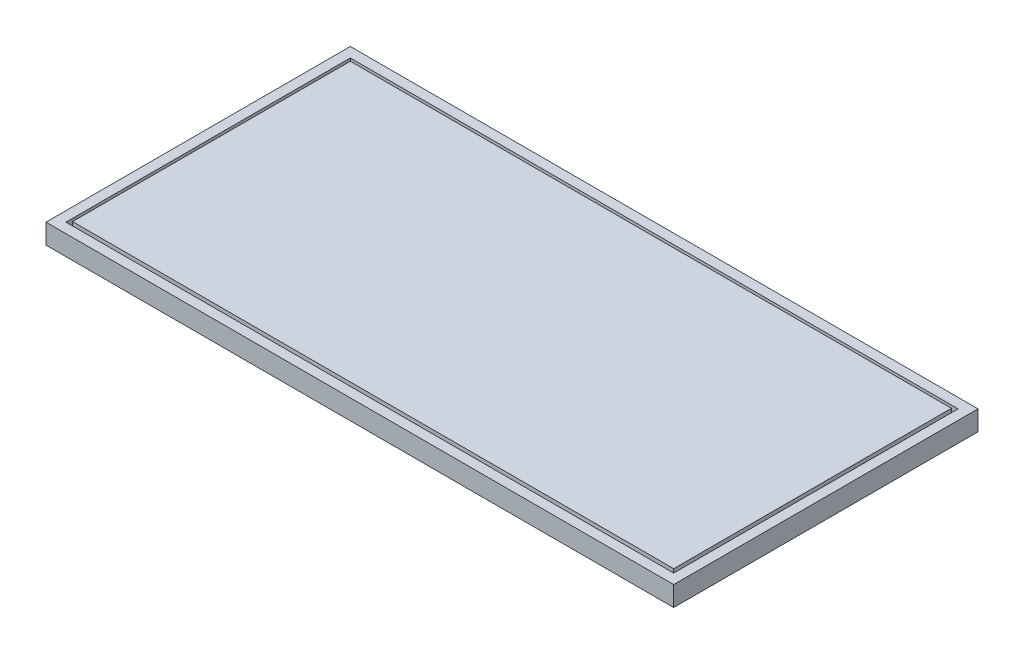
ISO-10303-21;
HEADER;
FILE_DESCRIPTION(('STEP AP214'),'2;1');
FILE_NAME('part.step','',(''),(''),'','','');
FILE_SCHEMA(('AUTOMOTIVE_DESIGN { 1 0 10303 214 1 1 1 1 }'));
ENDSEC;
DATA;
#1=APPLICATION_CONTEXT('core data for automotive mechanical design processes');
#2=APPLICATION_PROTOCOL_DEFINITION('international standard','automotive_design',2000,#1);
#3=PRODUCT_CONTEXT('',#1,'mechanical');
#4=PRODUCT('Part','Part','',(#3));
#5=PRODUCT_RELATED_PRODUCT_CATEGORY('part','',(#4));
#6=PRODUCT_DEFINITION_FORMATION('','',#4);
#7=PRODUCT_DEFINITION_CONTEXT('part definition',#1,'design');
#8=PRODUCT_DEFINITION('design','',#6,#7);
#9=PRODUCT_DEFINITION_SHAPE('','',#8);
#10=(LENGTH_UNIT() NAMED_UNIT(*) SI_UNIT(.MILLI.,.METRE.));
#11=(NAMED_UNIT(*) PLANE_ANGLE_UNIT() SI_UNIT($,.RADIAN.));
#12=(NAMED_UNIT(*) SI_UNIT($,.STERADIAN.) SOLID_ANGLE_UNIT());
#13=UNCERTAINTY_MEASURE_WITH_UNIT(LENGTH_MEASURE(1.E-05),#10,'distance_accuracy_value','');
#14=(GEOMETRIC_REPRESENTATION_CONTEXT(3) GLOBAL_UNCERTAINTY_ASSIGNED_CONTEXT((#13)) GLOBAL_UNIT_ASSIGNED_CONTEXT((#10,
#11,#12)) REPRESENTATION_CONTEXT('',''));
#15=CARTESIAN_POINT('',(0.,0.,0.));
#16=DIRECTION('',(0.,0.,1.));
#17=DIRECTION('',(1.,0.,0.));
#18=AXIS2_PLACEMENT_3D('',#15,#16,#17);
#19=CARTESIAN_POINT('',(0.,1.524,-23.3045));
#20=DIRECTION('',(0.,0.,-1.));
#21=DIRECTION('',(-1.,0.,0.));
#22=AXIS2_PLACEMENT_3D('',#19,#20,#21);
#23=PLANE('',#22);
#24=DIRECTION('',(0.,-1.,0.));
#25=VECTOR('',#24,1.);
#26=CARTESIAN_POINT('',(48.0695,1.524,-23.3045));
#27=LINE('',#26,#25);
#28=CARTESIAN_POINT('',(48.0695,1.524,-23.3045));
#29=VERTEX_POINT('',#28);
#30=CARTESIAN_POINT('',(48.0695,-1.524,-23.3045));
#31=VERTEX_POINT('',#30);
#32=EDGE_CURVE('E168',#29,#31,#27,.T.);
#33=ORIENTED_EDGE('',*,*,#32,.T.);
#34=DIRECTION('',(1.,0.,0.));
#35=VECTOR('',#34,1.);
#36=CARTESIAN_POINT('',(0.,-1.524,-23.3045));
#37=LINE('',#36,#35);
#38=CARTESIAN_POINT('',(-48.0695,-1.524,-23.3045));
#39=VERTEX_POINT('',#38);
#40=EDGE_CURVE('E138',#39,#31,#37,.T.);
#41=ORIENTED_EDGE('',*,*,#40,.F.);
#42=DIRECTION('',(0.,-1.,0.));
#43=VECTOR('',#42,1.);
#44=CARTESIAN_POINT('',(-48.0695,1.524,-23.3045));
#45=LINE('',#44,#43);
#46=CARTESIAN_POINT('',(-48.0695,1.524,-23.3045));
#47=VERTEX_POINT('',#46);
#48=EDGE_CURVE('E12',#47,#39,#45,.T.);
#49=ORIENTED_EDGE('',*,*,#48,.F.);
#50=DIRECTION('',(1.,0.,0.));
#51=VECTOR('',#50,1.);
#52=CARTESIAN_POINT('',(0.,1.524,-23.3045));
#53=LINE('',#52,#51);
#54=EDGE_CURVE('E157',#47,#29,#53,.T.);
#55=ORIENTED_EDGE('',*,*,#54,.T.);
#56=EDGE_LOOP('',(#33,#41,#49,#55));
#57=FACE_BOUND('',#56,.T.);
#58=ADVANCED_FACE('F43',(#57),#23,.T.);
#59=CARTESIAN_POINT('',(-48.0695,1.524,0.));
#60=DIRECTION('',(-1.,0.,0.));
#61=DIRECTION('',(0.,0.,1.));
#62=AXIS2_PLACEMENT_3D('',#59,#60,#61);
#63=PLANE('',#62);
#64=ORIENTED_EDGE('',*,*,#48,.T.);
#65=DIRECTION('',(0.,0.,-1.));
#66=VECTOR('',#65,1.);
#67=CARTESIAN_POINT('',(-48.0695,-1.524,0.));
#68=LINE('',#67,#66);
#69=CARTESIAN_POINT('',(-48.0695,-1.524,23.3045));
#70=VERTEX_POINT('',#69);
#71=EDGE_CURVE('E147',#70,#39,#68,.T.);
#72=ORIENTED_EDGE('',*,*,#71,.F.);
#73=DIRECTION('',(0.,-1.,0.));
#74=VECTOR('',#73,1.);
#75=CARTESIAN_POINT('',(-48.0695,1.524,23.3045));
#76=LINE('',#75,#74);
#77=CARTESIAN_POINT('',(-48.0695,1.524,23.3045));
#78=VERTEX_POINT('',#77);
#79=EDGE_CURVE('E52',#78,#70,#76,.T.);
#80=ORIENTED_EDGE('',*,*,#79,.F.);
#81=DIRECTION('',(0.,0.,-1.));
#82=VECTOR('',#81,1.);
#83=CARTESIAN_POINT('',(-48.0695,1.524,0.));
#84=LINE('',#83,#82);
#85=EDGE_CURVE('E120',#78,#47,#84,.T.);
#86=ORIENTED_EDGE('',*,*,#85,.T.);
#87=EDGE_LOOP('',(#64,#72,#80,#86));
#88=FACE_BOUND('',#87,.T.);
#89=ADVANCED_FACE('F188',(#88),#63,.T.);
#90=CARTESIAN_POINT('',(0.,1.524,23.3045));
#91=DIRECTION('',(0.,0.,1.));
#92=DIRECTION('',(1.,0.,0.));
#93=AXIS2_PLACEMENT_3D('',#90,#91,#92);
#94=PLANE('',#93);
#95=ORIENTED_EDGE('',*,*,#79,.T.);
#96=DIRECTION('',(-1.,0.,0.));
#97=VECTOR('',#96,1.);
#98=CARTESIAN_POINT('',(0.,-1.524,23.3045));
#99=LINE('',#98,#97);
#100=CARTESIAN_POINT('',(48.0695,-1.524,23.3045));
#101=VERTEX_POINT('',#100);
#102=EDGE_CURVE('E144',#101,#70,#99,.T.);
#103=ORIENTED_EDGE('',*,*,#102,.F.);
#104=DIRECTION('',(0.,-1.,0.));
#105=VECTOR('',#104,1.);
#106=CARTESIAN_POINT('',(48.0695,1.524,23.3045));
#107=LINE('',#106,#105);
#108=CARTESIAN_POINT('',(48.0695,1.524,23.3045));
#109=VERTEX_POINT('',#108);
#110=EDGE_CURVE('E166',#109,#101,#107,.T.);
#111=ORIENTED_EDGE('',*,*,#110,.F.);
#112=DIRECTION('',(-1.,0.,0.));
#113=VECTOR('',#112,1.);
#114=CARTESIAN_POINT('',(0.,1.524,23.3045));
#115=LINE('',#114,#113);
#116=EDGE_CURVE('E162',#109,#78,#115,.T.);
#117=ORIENTED_EDGE('',*,*,#116,.T.);
#118=EDGE_LOOP('',(#95,#103,#111,#117));
#119=FACE_BOUND('',#118,.T.);
#120=ADVANCED_FACE('F193',(#119),#94,.T.);
#121=CARTESIAN_POINT('',(46.5455,1.524,0.));
#122=DIRECTION('',(1.,0.,0.));
#123=DIRECTION('',(0.,0.,-1.));
#124=AXIS2_PLACEMENT_3D('',#121,#122,#123);
#125=PLANE('',#124);
#126=DIRECTION('',(0.,-1.,0.));
#127=VECTOR('',#126,1.);
#128=CARTESIAN_POINT('',(46.5455,1.524,-21.7805));
#129=LINE('',#128,#127);
#130=CARTESIAN_POINT('',(46.5455,1.524,-21.7805));
#131=VERTEX_POINT('',#130);
#132=CARTESIAN_POINT('',(46.5455,-1.524,-21.7805));
#133=VERTEX_POINT('',#132);
#134=EDGE_CURVE('E47',#131,#133,#129,.T.);
#135=ORIENTED_EDGE('',*,*,#134,.T.);
#136=DIRECTION('',(0.,0.,1.));
#137=VECTOR('',#136,1.);
#138=CARTESIAN_POINT('',(46.5455,-1.524,0.));
#139=LINE('',#138,#137);
#140=CARTESIAN_POINT('',(46.5455,-1.524,21.7805));
#141=VERTEX_POINT('',#140);
#142=EDGE_CURVE('E112',#133,#141,#139,.T.);
#143=ORIENTED_EDGE('',*,*,#142,.T.);
#144=DIRECTION('',(0.,-1.,0.));
#145=VECTOR('',#144,1.);
#146=CARTESIAN_POINT('',(46.5455,1.524,21.7805));
#147=LINE('',#146,#145);
#148=CARTESIAN_POINT('',(46.5455,1.524,21.7805));
#149=VERTEX_POINT('',#148);
#150=EDGE_CURVE('E170',#149,#141,#147,.T.);
#151=ORIENTED_EDGE('',*,*,#150,.F.);
#152=DIRECTION('',(0.,0.,1.));
#153=VECTOR('',#152,1.);
#154=CARTESIAN_POINT('',(46.5455,1.524,0.));
#155=LINE('',#154,#153);
#156=EDGE_CURVE('E115',#131,#149,#155,.T.);
#157=ORIENTED_EDGE('',*,*,#156,.F.);
#158=EDGE_LOOP('',(#135,#143,#151,#157));
#159=FACE_BOUND('',#158,.T.);
#160=ADVANCED_FACE('F45',(#159),#125,.F.);
#161=CARTESIAN_POINT('',(0.,1.524,21.7805));
#162=DIRECTION('',(0.,0.,1.));
#163=DIRECTION('',(1.,0.,0.));
#164=AXIS2_PLACEMENT_3D('',#161,#162,#163);
#165=PLANE('',#164);
#166=ORIENTED_EDGE('',*,*,#150,.T.);
#167=DIRECTION('',(-1.,0.,0.));
#168=VECTOR('',#167,1.);
#169=CARTESIAN_POINT('',(0.,-1.524,21.7805));
#170=LINE('',#169,#168);
#171=CARTESIAN_POINT('',(-46.5455,-1.524,21.7805));
#172=VERTEX_POINT('',#171);
#173=EDGE_CURVE('E129',#141,#172,#170,.T.);
#174=ORIENTED_EDGE('',*,*,#173,.T.);
#175=DIRECTION('',(0.,-1.,0.));
#176=VECTOR('',#175,1.);
#177=CARTESIAN_POINT('',(-46.5455,1.524,21.7805));
#178=LINE('',#177,#176);
#179=CARTESIAN_POINT('',(-46.5455,1.524,21.7805));
#180=VERTEX_POINT('',#179);
#181=EDGE_CURVE('E172',#180,#172,#178,.T.);
#182=ORIENTED_EDGE('',*,*,#181,.F.);
#183=DIRECTION('',(-1.,0.,0.));
#184=VECTOR('',#183,1.);
#185=CARTESIAN_POINT('',(0.,1.524,21.7805));
#186=LINE('',#185,#184);
#187=EDGE_CURVE('E155',#149,#180,#186,.T.);
#188=ORIENTED_EDGE('',*,*,#187,.F.);
#189=EDGE_LOOP('',(#166,#174,#182,#188));
#190=FACE_BOUND('',#189,.T.);
#191=ADVANCED_FACE('F178',(#190),#165,.F.);
#192=CARTESIAN_POINT('',(-46.5455,1.524,0.));
#193=DIRECTION('',(-1.,0.,0.));
#194=DIRECTION('',(0.,0.,1.));
#195=AXIS2_PLACEMENT_3D('',#192,#193,#194);
#196=PLANE('',#195);
#197=ORIENTED_EDGE('',*,*,#181,.T.);
#198=DIRECTION('',(0.,0.,-1.));
#199=VECTOR('',#198,1.);
#200=CARTESIAN_POINT('',(-46.5455,-1.524,0.));
#201=LINE('',#200,#199);
#202=CARTESIAN_POINT('',(-46.5455,-1.524,-21.7805));
#203=VERTEX_POINT('',#202);
#204=EDGE_CURVE('E133',#172,#203,#201,.T.);
#205=ORIENTED_EDGE('',*,*,#204,.T.);
#206=DIRECTION('',(0.,-1.,0.));
#207=VECTOR('',#206,1.);
#208=CARTESIAN_POINT('',(-46.5455,1.524,-21.7805));
#209=LINE('',#208,#207);
#210=CARTESIAN_POINT('',(-46.5455,1.524,-21.7805));
#211=VERTEX_POINT('',#210);
#212=EDGE_CURVE('E119',#211,#203,#209,.T.);
#213=ORIENTED_EDGE('',*,*,#212,.F.);
#214=DIRECTION('',(0.,0.,-1.));
#215=VECTOR('',#214,1.);
#216=CARTESIAN_POINT('',(-46.5455,1.524,0.));
#217=LINE('',#216,#215);
#218=EDGE_CURVE('E153',#180,#211,#217,.T.);
#219=ORIENTED_EDGE('',*,*,#218,.F.);
#220=EDGE_LOOP('',(#197,#205,#213,#219));
#221=FACE_BOUND('',#220,.T.);
#222=ADVANCED_FACE('F176',(#221),#196,.F.);
#223=CARTESIAN_POINT('',(0.,1.524,-21.7805));
#224=DIRECTION('',(0.,0.,-1.));
#225=DIRECTION('',(-1.,0.,0.));
#226=AXIS2_PLACEMENT_3D('',#223,#224,#225);
#227=PLANE('',#226);
#228=ORIENTED_EDGE('',*,*,#212,.T.);
#229=DIRECTION('',(1.,0.,0.));
#230=VECTOR('',#229,1.);
#231=CARTESIAN_POINT('',(0.,-1.524,-21.7805));
#232=LINE('',#231,#230);
#233=EDGE_CURVE('E126',#203,#133,#232,.T.);
#234=ORIENTED_EDGE('',*,*,#233,.T.);
#235=ORIENTED_EDGE('',*,*,#134,.F.);
#236=DIRECTION('',(1.,0.,0.));
#237=VECTOR('',#236,1.);
#238=CARTESIAN_POINT('',(0.,1.524,-21.7805));
#239=LINE('',#238,#237);
#240=EDGE_CURVE('E151',#211,#131,#239,.T.);
#241=ORIENTED_EDGE('',*,*,#240,.F.);
#242=EDGE_LOOP('',(#228,#234,#235,#241));
#243=FACE_BOUND('',#242,.T.);
#244=ADVANCED_FACE('F131',(#243),#227,.F.);
#245=CARTESIAN_POINT('',(48.0695,1.524,0.));
#246=DIRECTION('',(1.,0.,0.));
#247=DIRECTION('',(0.,0.,-1.));
#248=AXIS2_PLACEMENT_3D('',#245,#246,#247);
#249=PLANE('',#248);
#250=ORIENTED_EDGE('',*,*,#110,.T.);
#251=DIRECTION('',(0.,0.,1.));
#252=VECTOR('',#251,1.);
#253=CARTESIAN_POINT('',(48.0695,-1.524,0.));
#254=LINE('',#253,#252);
#255=EDGE_CURVE('E141',#31,#101,#254,.T.);
#256=ORIENTED_EDGE('',*,*,#255,.F.);
#257=ORIENTED_EDGE('',*,*,#32,.F.);
#258=DIRECTION('',(0.,0.,1.));
#259=VECTOR('',#258,1.);
#260=CARTESIAN_POINT('',(48.0695,1.524,0.));
#261=LINE('',#260,#259);
#262=EDGE_CURVE('E159',#29,#109,#261,.T.);
#263=ORIENTED_EDGE('',*,*,#262,.T.);
#264=EDGE_LOOP('',(#250,#256,#257,#263));
#265=FACE_BOUND('',#264,.T.);
#266=ADVANCED_FACE('F183',(#265),#249,.T.);
#267=CARTESIAN_POINT('',(0.,1.524,0.));
#268=DIRECTION('',(0.,-1.,0.));
#269=DIRECTION('',(0.,0.,-1.));
#270=AXIS2_PLACEMENT_3D('',#267,#268,#269);
#271=PLANE('',#270);
#272=ORIENTED_EDGE('',*,*,#156,.T.);
#273=ORIENTED_EDGE('',*,*,#187,.T.);
#274=ORIENTED_EDGE('',*,*,#218,.T.);
#275=ORIENTED_EDGE('',*,*,#240,.T.);
#276=EDGE_LOOP('',(#272,#273,#274,#275));
#277=FACE_BOUND('',#276,.T.);
#278=ORIENTED_EDGE('',*,*,#54,.F.);
#279=ORIENTED_EDGE('',*,*,#85,.F.);
#280=ORIENTED_EDGE('',*,*,#116,.F.);
#281=ORIENTED_EDGE('',*,*,#262,.F.);
#282=EDGE_LOOP('',(#278,#279,#280,#281));
#283=FACE_BOUND('',#282,.T.);
#284=ADVANCED_FACE('F180',(#277,#283),#271,.F.);
#285=CARTESIAN_POINT('',(0.,-1.524,0.));
#286=DIRECTION('',(0.,-1.,0.));
#287=DIRECTION('',(0.,0.,-1.));
#288=AXIS2_PLACEMENT_3D('',#285,#286,#287);
#289=PLANE('',#288);
#290=ORIENTED_EDGE('',*,*,#142,.F.);
#291=ORIENTED_EDGE('',*,*,#233,.F.);
#292=ORIENTED_EDGE('',*,*,#204,.F.);
#293=ORIENTED_EDGE('',*,*,#173,.F.);
#294=EDGE_LOOP('',(#290,#291,#292,#293));
#295=FACE_BOUND('',#294,.T.);
#296=ORIENTED_EDGE('',*,*,#40,.T.);
#297=ORIENTED_EDGE('',*,*,#255,.T.);
#298=ORIENTED_EDGE('',*,*,#102,.T.);
#299=ORIENTED_EDGE('',*,*,#71,.T.);
#300=EDGE_LOOP('',(#296,#297,#298,#299));
#301=FACE_BOUND('',#300,.T.);
#302=ADVANCED_FACE('F123',(#295,#301),#289,.T.);
#303=CLOSED_SHELL('',(#58,#89,#120,#160,#191,#222,#244,#266,#284,#302));
#304=MANIFOLD_SOLID_BREP('B2',#303);
#305=CARTESIAN_POINT('',(46.0375,1.6,-21.2725));
#306=DIRECTION('',(-1.,0.,0.));
#307=DIRECTION('',(0.,0.,1.));
#308=AXIS2_PLACEMENT_3D('',#305,#306,#307);
#309=PLANE('',#308);
#310=DIRECTION('',(0.,0.,-1.));
#311=VECTOR('',#310,1.);
#312=CARTESIAN_POINT('',(46.0375,0.,-21.2725));
#313=LINE('',#312,#311);
#314=CARTESIAN_POINT('',(46.0375,0.,21.2725));
#315=VERTEX_POINT('',#314);
#316=CARTESIAN_POINT('',(46.0375,0.,-21.2725));
#317=VERTEX_POINT('',#316);
#318=EDGE_CURVE('E336',#315,#317,#313,.T.);
#319=ORIENTED_EDGE('',*,*,#318,.T.);
#320=DIRECTION('',(0.,-1.,0.));
#321=VECTOR('',#320,1.);
#322=CARTESIAN_POINT('',(46.0375,1.6,-21.2725));
#323=LINE('',#322,#321);
#324=CARTESIAN_POINT('',(46.0375,1.6,-21.2725));
#325=VERTEX_POINT('',#324);
#326=EDGE_CURVE('E41',#325,#317,#323,.T.);
#327=ORIENTED_EDGE('',*,*,#326,.F.);
#328=DIRECTION('',(0.,0.,-1.));
#329=VECTOR('',#328,1.);
#330=CARTESIAN_POINT('',(46.0375,1.6,-21.2725));
#331=LINE('',#330,#329);
#332=CARTESIAN_POINT('',(46.0375,1.6,21.2725));
#333=VERTEX_POINT('',#332);
#334=EDGE_CURVE('E324',#333,#325,#331,.T.);
#335=ORIENTED_EDGE('',*,*,#334,.F.);
#336=DIRECTION('',(0.,-1.,0.));
#337=VECTOR('',#336,1.);
#338=CARTESIAN_POINT('',(46.0375,1.6,21.2725));
#339=LINE('',#338,#337);
#340=EDGE_CURVE('E332',#333,#315,#339,.T.);
#341=ORIENTED_EDGE('',*,*,#340,.T.);
#342=EDGE_LOOP('',(#319,#327,#335,#341));
#343=FACE_BOUND('',#342,.T.);
#344=ADVANCED_FACE('F273',(#343),#309,.F.);
#345=CARTESIAN_POINT('',(-46.0375,1.6,-21.2725));
#346=DIRECTION('',(0.,0.,1.));
#347=DIRECTION('',(1.,0.,0.));
#348=AXIS2_PLACEMENT_3D('',#345,#346,#347);
#349=PLANE('',#348);
#350=DIRECTION('',(-1.,0.,0.));
#351=VECTOR('',#350,1.);
#352=CARTESIAN_POINT('',(-46.0375,0.,-21.2725));
#353=LINE('',#352,#351);
#354=CARTESIAN_POINT('',(-46.0375,0.,-21.2725));
#355=VERTEX_POINT('',#354);
#356=EDGE_CURVE('E328',#317,#355,#353,.T.);
#357=ORIENTED_EDGE('',*,*,#356,.T.);
#358=DIRECTION('',(0.,-1.,0.));
#359=VECTOR('',#358,1.);
#360=CARTESIAN_POINT('',(-46.0375,1.6,-21.2725));
#361=LINE('',#360,#359);
#362=CARTESIAN_POINT('',(-46.0375,1.6,-21.2725));
#363=VERTEX_POINT('',#362);
#364=EDGE_CURVE('E281',#363,#355,#361,.T.);
#365=ORIENTED_EDGE('',*,*,#364,.F.);
#366=DIRECTION('',(-1.,0.,0.));
#367=VECTOR('',#366,1.);
#368=CARTESIAN_POINT('',(-46.0375,1.6,-21.2725));
#369=LINE('',#368,#367);
#370=EDGE_CURVE('E319',#325,#363,#369,.T.);
#371=ORIENTED_EDGE('',*,*,#370,.F.);
#372=ORIENTED_EDGE('',*,*,#326,.T.);
#373=EDGE_LOOP('',(#357,#365,#371,#372));
#374=FACE_BOUND('',#373,.T.);
#375=ADVANCED_FACE('F327',(#374),#349,.F.);
#376=CARTESIAN_POINT('',(-46.0375,1.6,-21.2725));
#377=DIRECTION('',(1.,0.,0.));
#378=DIRECTION('',(0.,0.,-1.));
#379=AXIS2_PLACEMENT_3D('',#376,#377,#378);
#380=PLANE('',#379);
#381=DIRECTION('',(0.,0.,1.));
#382=VECTOR('',#381,1.);
#383=CARTESIAN_POINT('',(-46.0375,0.,-21.2725));
#384=LINE('',#383,#382);
#385=CARTESIAN_POINT('',(-46.0375,0.,21.2725));
#386=VERTEX_POINT('',#385);
#387=EDGE_CURVE('E306',#355,#386,#384,.T.);
#388=ORIENTED_EDGE('',*,*,#387,.T.);
#389=DIRECTION('',(0.,-1.,0.));
#390=VECTOR('',#389,1.);
#391=CARTESIAN_POINT('',(-46.0375,1.6,21.2725));
#392=LINE('',#391,#390);
#393=CARTESIAN_POINT('',(-46.0375,1.6,21.2725));
#394=VERTEX_POINT('',#393);
#395=EDGE_CURVE('E329',#394,#386,#392,.T.);
#396=ORIENTED_EDGE('',*,*,#395,.F.);
#397=DIRECTION('',(0.,0.,1.));
#398=VECTOR('',#397,1.);
#399=CARTESIAN_POINT('',(-46.0375,1.6,-21.2725));
#400=LINE('',#399,#398);
#401=EDGE_CURVE('E322',#363,#394,#400,.T.);
#402=ORIENTED_EDGE('',*,*,#401,.F.);
#403=ORIENTED_EDGE('',*,*,#364,.T.);
#404=EDGE_LOOP('',(#388,#396,#402,#403));
#405=FACE_BOUND('',#404,.T.);
#406=ADVANCED_FACE('F330',(#405),#380,.F.);
#407=CARTESIAN_POINT('',(-46.0375,1.6,21.2725));
#408=DIRECTION('',(0.,0.,-1.));
#409=DIRECTION('',(-1.,0.,0.));
#410=AXIS2_PLACEMENT_3D('',#407,#408,#409);
#411=PLANE('',#410);
#412=DIRECTION('',(1.,0.,0.));
#413=VECTOR('',#412,1.);
#414=CARTESIAN_POINT('',(-46.0375,0.,21.2725));
#415=LINE('',#414,#413);
#416=EDGE_CURVE('E312',#386,#315,#415,.T.);
#417=ORIENTED_EDGE('',*,*,#416,.T.);
#418=ORIENTED_EDGE('',*,*,#340,.F.);
#419=DIRECTION('',(1.,0.,0.));
#420=VECTOR('',#419,1.);
#421=CARTESIAN_POINT('',(-46.0375,1.6,21.2725));
#422=LINE('',#421,#420);
#423=EDGE_CURVE('E289',#394,#333,#422,.T.);
#424=ORIENTED_EDGE('',*,*,#423,.F.);
#425=ORIENTED_EDGE('',*,*,#395,.T.);
#426=EDGE_LOOP('',(#417,#418,#424,#425));
#427=FACE_BOUND('',#426,.T.);
#428=ADVANCED_FACE('F343',(#427),#411,.F.);
#429=CARTESIAN_POINT('',(0.,1.6,0.));
#430=DIRECTION('',(0.,1.,0.));
#431=DIRECTION('',(0.,0.,1.));
#432=AXIS2_PLACEMENT_3D('',#429,#430,#431);
#433=PLANE('',#432);
#434=ORIENTED_EDGE('',*,*,#334,.T.);
#435=ORIENTED_EDGE('',*,*,#370,.T.);
#436=ORIENTED_EDGE('',*,*,#401,.T.);
#437=ORIENTED_EDGE('',*,*,#423,.T.);
#438=EDGE_LOOP('',(#434,#435,#436,#437));
#439=FACE_BOUND('',#438,.T.);
#440=ADVANCED_FACE('F320',(#439),#433,.T.);
#441=CARTESIAN_POINT('',(0.,0.,0.));
#442=DIRECTION('',(0.,1.,0.));
#443=DIRECTION('',(0.,0.,1.));
#444=AXIS2_PLACEMENT_3D('',#441,#442,#443);
#445=PLANE('',#444);
#446=ORIENTED_EDGE('',*,*,#318,.F.);
#447=ORIENTED_EDGE('',*,*,#416,.F.);
#448=ORIENTED_EDGE('',*,*,#387,.F.);
#449=ORIENTED_EDGE('',*,*,#356,.F.);
#450=EDGE_LOOP('',(#446,#447,#448,#449));
#451=FACE_BOUND('',#450,.T.);
#452=ADVANCED_FACE('F346',(#451),#445,.F.);
#453=CLOSED_SHELL('',(#344,#375,#406,#428,#440,#452));
#454=MANIFOLD_SOLID_BREP('B6',#453);
#455=ADVANCED_BREP_SHAPE_REPRESENTATION('',(#18,#304,#454),#14);
#456=SHAPE_DEFINITION_REPRESENTATION(#9,#455);
ENDSEC;
END-ISO-10303-21;
